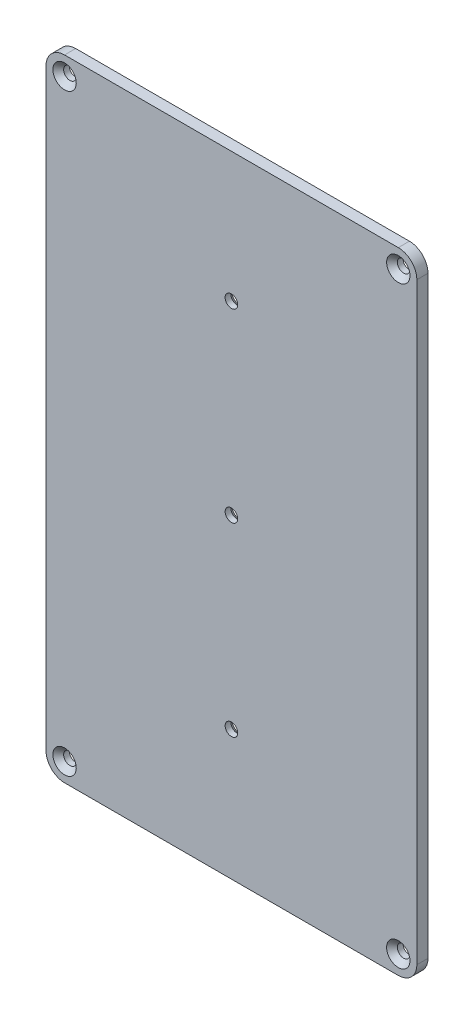
ISO-10303-21;
HEADER;
FILE_DESCRIPTION(('STEP AP214'),'2;1');
FILE_NAME('part.step','',(''),(''),'','','');
FILE_SCHEMA(('AUTOMOTIVE_DESIGN { 1 0 10303 214 1 1 1 1 }'));
ENDSEC;
DATA;
#1=APPLICATION_CONTEXT('core data for automotive mechanical design processes');
#2=APPLICATION_PROTOCOL_DEFINITION('international standard','automotive_design',2000,#1);
#3=PRODUCT_CONTEXT('',#1,'mechanical');
#4=PRODUCT('Part','Part','',(#3));
#5=PRODUCT_RELATED_PRODUCT_CATEGORY('part','',(#4));
#6=PRODUCT_DEFINITION_FORMATION('','',#4);
#7=PRODUCT_DEFINITION_CONTEXT('part definition',#1,'design');
#8=PRODUCT_DEFINITION('design','',#6,#7);
#9=PRODUCT_DEFINITION_SHAPE('','',#8);
#10=(LENGTH_UNIT() NAMED_UNIT(*) SI_UNIT(.MILLI.,.METRE.));
#11=(NAMED_UNIT(*) PLANE_ANGLE_UNIT() SI_UNIT($,.RADIAN.));
#12=(NAMED_UNIT(*) SI_UNIT($,.STERADIAN.) SOLID_ANGLE_UNIT());
#13=UNCERTAINTY_MEASURE_WITH_UNIT(LENGTH_MEASURE(1.E-05),#10,'distance_accuracy_value','');
#14=(GEOMETRIC_REPRESENTATION_CONTEXT(3) GLOBAL_UNCERTAINTY_ASSIGNED_CONTEXT((#13)) GLOBAL_UNIT_ASSIGNED_CONTEXT((#10,
#11,#12)) REPRESENTATION_CONTEXT('',''));
#15=CARTESIAN_POINT('',(0.,0.,0.));
#16=DIRECTION('',(0.,0.,1.));
#17=DIRECTION('',(1.,0.,0.));
#18=AXIS2_PLACEMENT_3D('',#15,#16,#17);
#19=CARTESIAN_POINT('',(0.,0.,3.));
#20=DIRECTION('',(1.,0.,0.));
#21=DIRECTION('',(0.,1.,0.));
#22=AXIS2_PLACEMENT_3D('',#19,#20,#21);
#23=PLANE('',#22);
#24=DIRECTION('',(0.,-1.,0.));
#25=VECTOR('',#24,1.);
#26=CARTESIAN_POINT('',(0.,0.,0.));
#27=LINE('',#26,#25);
#28=CARTESIAN_POINT('',(0.,165.,0.));
#29=VERTEX_POINT('',#28);
#30=CARTESIAN_POINT('',(0.,5.,0.));
#31=VERTEX_POINT('',#30);
#32=EDGE_CURVE('E140',#29,#31,#27,.T.);
#33=ORIENTED_EDGE('',*,*,#32,.T.);
#34=DIRECTION('',(0.,0.,-1.));
#35=VECTOR('',#34,1.);
#36=CARTESIAN_POINT('',(0.,5.,3.));
#37=LINE('',#36,#35);
#38=CARTESIAN_POINT('',(0.,5.,3.));
#39=VERTEX_POINT('',#38);
#40=EDGE_CURVE('E11',#31,#39,#37,.F.);
#41=ORIENTED_EDGE('',*,*,#40,.T.);
#42=DIRECTION('',(0.,-1.,0.));
#43=VECTOR('',#42,1.);
#44=CARTESIAN_POINT('',(0.,0.,3.));
#45=LINE('',#44,#43);
#46=CARTESIAN_POINT('',(0.,165.,3.));
#47=VERTEX_POINT('',#46);
#48=EDGE_CURVE('E128',#47,#39,#45,.T.);
#49=ORIENTED_EDGE('',*,*,#48,.F.);
#50=DIRECTION('',(0.,0.,-1.));
#51=VECTOR('',#50,1.);
#52=CARTESIAN_POINT('',(0.,165.,3.));
#53=LINE('',#52,#51);
#54=EDGE_CURVE('E43',#47,#29,#53,.T.);
#55=ORIENTED_EDGE('',*,*,#54,.T.);
#56=EDGE_LOOP('',(#33,#41,#49,#55));
#57=FACE_BOUND('',#56,.T.);
#58=ADVANCED_FACE('F34',(#57),#23,.F.);
#59=CARTESIAN_POINT('',(0.,0.,3.));
#60=DIRECTION('',(0.,1.,0.));
#61=DIRECTION('',(0.,0.,1.));
#62=AXIS2_PLACEMENT_3D('',#59,#60,#61);
#63=PLANE('',#62);
#64=DIRECTION('',(1.,0.,0.));
#65=VECTOR('',#64,1.);
#66=CARTESIAN_POINT('',(0.,0.,0.));
#67=LINE('',#66,#65);
#68=CARTESIAN_POINT('',(5.,0.,0.));
#69=VERTEX_POINT('',#68);
#70=CARTESIAN_POINT('',(95.,0.,0.));
#71=VERTEX_POINT('',#70);
#72=EDGE_CURVE('E133',#69,#71,#67,.T.);
#73=ORIENTED_EDGE('',*,*,#72,.T.);
#74=DIRECTION('',(0.,0.,-1.));
#75=VECTOR('',#74,1.);
#76=CARTESIAN_POINT('',(95.,0.,3.));
#77=LINE('',#76,#75);
#78=CARTESIAN_POINT('',(95.,0.,3.));
#79=VERTEX_POINT('',#78);
#80=EDGE_CURVE('E51',#71,#79,#77,.F.);
#81=ORIENTED_EDGE('',*,*,#80,.T.);
#82=DIRECTION('',(1.,0.,0.));
#83=VECTOR('',#82,1.);
#84=CARTESIAN_POINT('',(0.,0.,3.));
#85=LINE('',#84,#83);
#86=CARTESIAN_POINT('',(5.,0.,3.));
#87=VERTEX_POINT('',#86);
#88=EDGE_CURVE('E131',#87,#79,#85,.T.);
#89=ORIENTED_EDGE('',*,*,#88,.F.);
#90=DIRECTION('',(0.,0.,-1.));
#91=VECTOR('',#90,1.);
#92=CARTESIAN_POINT('',(5.,0.,3.));
#93=LINE('',#92,#91);
#94=EDGE_CURVE('E172',#87,#69,#93,.T.);
#95=ORIENTED_EDGE('',*,*,#94,.T.);
#96=EDGE_LOOP('',(#73,#81,#89,#95));
#97=FACE_BOUND('',#96,.T.);
#98=ADVANCED_FACE('F224',(#97),#63,.F.);
#99=CARTESIAN_POINT('',(100.,0.,3.));
#100=DIRECTION('',(-1.,0.,0.));
#101=DIRECTION('',(0.,-1.,0.));
#102=AXIS2_PLACEMENT_3D('',#99,#100,#101);
#103=PLANE('',#102);
#104=DIRECTION('',(0.,1.,0.));
#105=VECTOR('',#104,1.);
#106=CARTESIAN_POINT('',(100.,0.,0.));
#107=LINE('',#106,#105);
#108=CARTESIAN_POINT('',(100.,5.,0.));
#109=VERTEX_POINT('',#108);
#110=CARTESIAN_POINT('',(100.,165.,0.));
#111=VERTEX_POINT('',#110);
#112=EDGE_CURVE('E129',#109,#111,#107,.T.);
#113=ORIENTED_EDGE('',*,*,#112,.T.);
#114=DIRECTION('',(0.,0.,-1.));
#115=VECTOR('',#114,1.);
#116=CARTESIAN_POINT('',(100.,165.,3.));
#117=LINE('',#116,#115);
#118=CARTESIAN_POINT('',(100.,165.,3.));
#119=VERTEX_POINT('',#118);
#120=EDGE_CURVE('E107',#111,#119,#117,.F.);
#121=ORIENTED_EDGE('',*,*,#120,.T.);
#122=DIRECTION('',(0.,1.,0.));
#123=VECTOR('',#122,1.);
#124=CARTESIAN_POINT('',(100.,0.,3.));
#125=LINE('',#124,#123);
#126=CARTESIAN_POINT('',(100.,5.,3.));
#127=VERTEX_POINT('',#126);
#128=EDGE_CURVE('E218',#127,#119,#125,.T.);
#129=ORIENTED_EDGE('',*,*,#128,.F.);
#130=DIRECTION('',(0.,0.,-1.));
#131=VECTOR('',#130,1.);
#132=CARTESIAN_POINT('',(100.,5.,3.));
#133=LINE('',#132,#131);
#134=EDGE_CURVE('E112',#127,#109,#133,.T.);
#135=ORIENTED_EDGE('',*,*,#134,.T.);
#136=EDGE_LOOP('',(#113,#121,#129,#135));
#137=FACE_BOUND('',#136,.T.);
#138=ADVANCED_FACE('F233',(#137),#103,.F.);
#139=CARTESIAN_POINT('',(0.,170.,3.));
#140=DIRECTION('',(0.,-1.,0.));
#141=DIRECTION('',(0.,0.,-1.));
#142=AXIS2_PLACEMENT_3D('',#139,#140,#141);
#143=PLANE('',#142);
#144=DIRECTION('',(-1.,0.,0.));
#145=VECTOR('',#144,1.);
#146=CARTESIAN_POINT('',(0.,170.,3.));
#147=LINE('',#146,#145);
#148=CARTESIAN_POINT('',(95.,170.,3.));
#149=VERTEX_POINT('',#148);
#150=CARTESIAN_POINT('',(4.99999999999997,170.,3.));
#151=VERTEX_POINT('',#150);
#152=EDGE_CURVE('E122',#149,#151,#147,.T.);
#153=ORIENTED_EDGE('',*,*,#152,.F.);
#154=DIRECTION('',(0.,0.,-1.));
#155=VECTOR('',#154,1.);
#156=CARTESIAN_POINT('',(95.,170.,3.));
#157=LINE('',#156,#155);
#158=CARTESIAN_POINT('',(95.,170.,0.));
#159=VERTEX_POINT('',#158);
#160=EDGE_CURVE('E106',#149,#159,#157,.T.);
#161=ORIENTED_EDGE('',*,*,#160,.T.);
#162=DIRECTION('',(-1.,0.,0.));
#163=VECTOR('',#162,1.);
#164=CARTESIAN_POINT('',(0.,170.,0.));
#165=LINE('',#164,#163);
#166=CARTESIAN_POINT('',(4.99999999999997,170.,0.));
#167=VERTEX_POINT('',#166);
#168=EDGE_CURVE('E119',#159,#167,#165,.T.);
#169=ORIENTED_EDGE('',*,*,#168,.T.);
#170=DIRECTION('',(0.,0.,-1.));
#171=VECTOR('',#170,1.);
#172=CARTESIAN_POINT('',(4.99999999999997,170.,3.));
#173=LINE('',#172,#171);
#174=EDGE_CURVE('E124',#167,#151,#173,.F.);
#175=ORIENTED_EDGE('',*,*,#174,.T.);
#176=EDGE_LOOP('',(#153,#161,#169,#175));
#177=FACE_BOUND('',#176,.T.);
#178=ADVANCED_FACE('F118',(#177),#143,.F.);
#179=CARTESIAN_POINT('',(0.,0.,3.));
#180=DIRECTION('',(0.,0.,-1.));
#181=DIRECTION('',(-1.,0.,0.));
#182=AXIS2_PLACEMENT_3D('',#179,#180,#181);
#183=PLANE('',#182);
#184=CARTESIAN_POINT('',(50.,135.,3.));
#185=DIRECTION('',(0.,0.,-1.));
#186=DIRECTION('',(-1.,0.,0.));
#187=AXIS2_PLACEMENT_3D('',#184,#185,#186);
#188=CIRCLE('',#187,1.69999999999999);
#189=CARTESIAN_POINT('',(48.3,135.,3.));
#190=VERTEX_POINT('',#189);
#191=EDGE_CURVE('E38',#190,#190,#188,.T.);
#192=ORIENTED_EDGE('',*,*,#191,.T.);
#193=EDGE_LOOP('',(#192));
#194=FACE_BOUND('',#193,.T.);
#195=CARTESIAN_POINT('',(50.,85.,3.));
#196=DIRECTION('',(0.,0.,-1.));
#197=DIRECTION('',(-1.,0.,0.));
#198=AXIS2_PLACEMENT_3D('',#195,#196,#197);
#199=CIRCLE('',#198,1.69999999999999);
#200=CARTESIAN_POINT('',(48.3,85.,3.));
#201=VERTEX_POINT('',#200);
#202=EDGE_CURVE('E182',#201,#201,#199,.T.);
#203=ORIENTED_EDGE('',*,*,#202,.T.);
#204=EDGE_LOOP('',(#203));
#205=FACE_BOUND('',#204,.T.);
#206=CARTESIAN_POINT('',(50.,35.,3.));
#207=DIRECTION('',(0.,0.,-1.));
#208=DIRECTION('',(-1.,0.,0.));
#209=AXIS2_PLACEMENT_3D('',#206,#207,#208);
#210=CIRCLE('',#209,1.69999999999999);
#211=CARTESIAN_POINT('',(48.3,35.,3.));
#212=VERTEX_POINT('',#211);
#213=EDGE_CURVE('E178',#212,#212,#210,.T.);
#214=ORIENTED_EDGE('',*,*,#213,.T.);
#215=EDGE_LOOP('',(#214));
#216=FACE_BOUND('',#215,.T.);
#217=CARTESIAN_POINT('',(4.99999999999997,165.,3.));
#218=DIRECTION('',(0.,0.,1.));
#219=DIRECTION('',(1.,0.,0.));
#220=AXIS2_PLACEMENT_3D('',#217,#218,#219);
#221=CIRCLE('',#220,3.15);
#222=CARTESIAN_POINT('',(8.14999999999997,165.,3.));
#223=VERTEX_POINT('',#222);
#224=EDGE_CURVE('E180',#223,#223,#221,.T.);
#225=ORIENTED_EDGE('',*,*,#224,.F.);
#226=EDGE_LOOP('',(#225));
#227=FACE_BOUND('',#226,.T.);
#228=CARTESIAN_POINT('',(95.,165.,3.));
#229=DIRECTION('',(0.,0.,1.));
#230=DIRECTION('',(1.,0.,0.));
#231=AXIS2_PLACEMENT_3D('',#228,#229,#230);
#232=CIRCLE('',#231,3.15);
#233=CARTESIAN_POINT('',(98.15,165.,3.));
#234=VERTEX_POINT('',#233);
#235=EDGE_CURVE('E155',#234,#234,#232,.T.);
#236=ORIENTED_EDGE('',*,*,#235,.F.);
#237=EDGE_LOOP('',(#236));
#238=FACE_BOUND('',#237,.T.);
#239=CARTESIAN_POINT('',(95.,5.,3.));
#240=DIRECTION('',(0.,0.,1.));
#241=DIRECTION('',(1.,0.,0.));
#242=AXIS2_PLACEMENT_3D('',#239,#240,#241);
#243=CIRCLE('',#242,3.15);
#244=CARTESIAN_POINT('',(98.15,5.,3.));
#245=VERTEX_POINT('',#244);
#246=EDGE_CURVE('E150',#245,#245,#243,.T.);
#247=ORIENTED_EDGE('',*,*,#246,.F.);
#248=EDGE_LOOP('',(#247));
#249=FACE_BOUND('',#248,.T.);
#250=CARTESIAN_POINT('',(4.99999999999999,5.,3.));
#251=DIRECTION('',(0.,0.,1.));
#252=DIRECTION('',(1.,0.,0.));
#253=AXIS2_PLACEMENT_3D('',#250,#251,#252);
#254=CIRCLE('',#253,3.15);
#255=CARTESIAN_POINT('',(8.14999999999999,5.,3.));
#256=VERTEX_POINT('',#255);
#257=EDGE_CURVE('E145',#256,#256,#254,.T.);
#258=ORIENTED_EDGE('',*,*,#257,.F.);
#259=EDGE_LOOP('',(#258));
#260=FACE_BOUND('',#259,.T.);
#261=ORIENTED_EDGE('',*,*,#128,.T.);
#262=CARTESIAN_POINT('',(95.,165.,3.));
#263=DIRECTION('',(0.,0.,-1.));
#264=DIRECTION('',(-1.,0.,0.));
#265=AXIS2_PLACEMENT_3D('',#262,#263,#264);
#266=CIRCLE('',#265,5.);
#267=EDGE_CURVE('E170',#119,#149,#266,.F.);
#268=ORIENTED_EDGE('',*,*,#267,.T.);
#269=ORIENTED_EDGE('',*,*,#152,.T.);
#270=CARTESIAN_POINT('',(4.99999999999997,165.,3.));
#271=DIRECTION('',(0.,0.,-1.));
#272=DIRECTION('',(-1.,0.,0.));
#273=AXIS2_PLACEMENT_3D('',#270,#271,#272);
#274=CIRCLE('',#273,5.);
#275=EDGE_CURVE('E165',#151,#47,#274,.F.);
#276=ORIENTED_EDGE('',*,*,#275,.T.);
#277=ORIENTED_EDGE('',*,*,#48,.T.);
#278=CARTESIAN_POINT('',(5.,5.,3.));
#279=DIRECTION('',(0.,0.,-1.));
#280=DIRECTION('',(-1.,0.,0.));
#281=AXIS2_PLACEMENT_3D('',#278,#279,#280);
#282=CIRCLE('',#281,5.);
#283=EDGE_CURVE('E58',#39,#87,#282,.F.);
#284=ORIENTED_EDGE('',*,*,#283,.T.);
#285=ORIENTED_EDGE('',*,*,#88,.T.);
#286=CARTESIAN_POINT('',(95.,5.,3.));
#287=DIRECTION('',(0.,0.,-1.));
#288=DIRECTION('',(-1.,0.,0.));
#289=AXIS2_PLACEMENT_3D('',#286,#287,#288);
#290=CIRCLE('',#289,5.);
#291=EDGE_CURVE('E168',#79,#127,#290,.F.);
#292=ORIENTED_EDGE('',*,*,#291,.T.);
#293=EDGE_LOOP('',(#261,#268,#269,#276,#277,#284,#285,#292));
#294=FACE_BOUND('',#293,.T.);
#295=ADVANCED_FACE('F231',(#194,#205,#216,#227,#238,#249,#260,#294),#183,.F.);
#296=CARTESIAN_POINT('',(0.,0.,0.));
#297=DIRECTION('',(0.,0.,-1.));
#298=DIRECTION('',(-1.,0.,0.));
#299=AXIS2_PLACEMENT_3D('',#296,#297,#298);
#300=PLANE('',#299);
#301=CARTESIAN_POINT('',(50.,135.,0.));
#302=DIRECTION('',(0.,0.,-1.));
#303=DIRECTION('',(-1.,0.,0.));
#304=AXIS2_PLACEMENT_3D('',#301,#302,#303);
#305=CIRCLE('',#304,3.15);
#306=CARTESIAN_POINT('',(46.85,135.,0.));
#307=VERTEX_POINT('',#306);
#308=EDGE_CURVE('E320',#307,#307,#305,.T.);
#309=ORIENTED_EDGE('',*,*,#308,.F.);
#310=EDGE_LOOP('',(#309));
#311=FACE_BOUND('',#310,.T.);
#312=CARTESIAN_POINT('',(50.,85.,0.));
#313=DIRECTION('',(0.,0.,-1.));
#314=DIRECTION('',(-1.,0.,0.));
#315=AXIS2_PLACEMENT_3D('',#312,#313,#314);
#316=CIRCLE('',#315,3.15);
#317=CARTESIAN_POINT('',(46.85,85.,0.));
#318=VERTEX_POINT('',#317);
#319=EDGE_CURVE('E191',#318,#318,#316,.T.);
#320=ORIENTED_EDGE('',*,*,#319,.F.);
#321=EDGE_LOOP('',(#320));
#322=FACE_BOUND('',#321,.T.);
#323=CARTESIAN_POINT('',(50.,35.,0.));
#324=DIRECTION('',(0.,0.,-1.));
#325=DIRECTION('',(-1.,0.,0.));
#326=AXIS2_PLACEMENT_3D('',#323,#324,#325);
#327=CIRCLE('',#326,3.15);
#328=CARTESIAN_POINT('',(46.85,35.,0.));
#329=VERTEX_POINT('',#328);
#330=EDGE_CURVE('E184',#329,#329,#327,.T.);
#331=ORIENTED_EDGE('',*,*,#330,.F.);
#332=EDGE_LOOP('',(#331));
#333=FACE_BOUND('',#332,.T.);
#334=CARTESIAN_POINT('',(4.99999999999997,165.,0.));
#335=DIRECTION('',(0.,0.,-1.));
#336=DIRECTION('',(-1.,0.,0.));
#337=AXIS2_PLACEMENT_3D('',#334,#335,#336);
#338=CIRCLE('',#337,1.69999999999999);
#339=CARTESIAN_POINT('',(3.29999999999998,165.,0.));
#340=VERTEX_POINT('',#339);
#341=EDGE_CURVE('E152',#340,#340,#338,.T.);
#342=ORIENTED_EDGE('',*,*,#341,.F.);
#343=EDGE_LOOP('',(#342));
#344=FACE_BOUND('',#343,.T.);
#345=CARTESIAN_POINT('',(95.,165.,0.));
#346=DIRECTION('',(0.,0.,-1.));
#347=DIRECTION('',(-1.,0.,0.));
#348=AXIS2_PLACEMENT_3D('',#345,#346,#347);
#349=CIRCLE('',#348,1.69999999999999);
#350=CARTESIAN_POINT('',(93.3,165.,0.));
#351=VERTEX_POINT('',#350);
#352=EDGE_CURVE('E147',#351,#351,#349,.T.);
#353=ORIENTED_EDGE('',*,*,#352,.F.);
#354=EDGE_LOOP('',(#353));
#355=FACE_BOUND('',#354,.T.);
#356=CARTESIAN_POINT('',(95.,5.,0.));
#357=DIRECTION('',(0.,0.,-1.));
#358=DIRECTION('',(-1.,0.,0.));
#359=AXIS2_PLACEMENT_3D('',#356,#357,#358);
#360=CIRCLE('',#359,1.69999999999999);
#361=CARTESIAN_POINT('',(93.3,5.,0.));
#362=VERTEX_POINT('',#361);
#363=EDGE_CURVE('E142',#362,#362,#360,.T.);
#364=ORIENTED_EDGE('',*,*,#363,.F.);
#365=EDGE_LOOP('',(#364));
#366=FACE_BOUND('',#365,.T.);
#367=CARTESIAN_POINT('',(4.99999999999999,5.,0.));
#368=DIRECTION('',(0.,0.,-1.));
#369=DIRECTION('',(-1.,0.,0.));
#370=AXIS2_PLACEMENT_3D('',#367,#368,#369);
#371=CIRCLE('',#370,1.69999999999999);
#372=CARTESIAN_POINT('',(3.3,5.,0.));
#373=VERTEX_POINT('',#372);
#374=EDGE_CURVE('E137',#373,#373,#371,.T.);
#375=ORIENTED_EDGE('',*,*,#374,.F.);
#376=EDGE_LOOP('',(#375));
#377=FACE_BOUND('',#376,.T.);
#378=ORIENTED_EDGE('',*,*,#168,.F.);
#379=CARTESIAN_POINT('',(95.,165.,0.));
#380=DIRECTION('',(0.,0.,-1.));
#381=DIRECTION('',(-1.,0.,0.));
#382=AXIS2_PLACEMENT_3D('',#379,#380,#381);
#383=CIRCLE('',#382,5.);
#384=EDGE_CURVE('E102',#159,#111,#383,.T.);
#385=ORIENTED_EDGE('',*,*,#384,.T.);
#386=ORIENTED_EDGE('',*,*,#112,.F.);
#387=CARTESIAN_POINT('',(95.,5.,0.));
#388=DIRECTION('',(0.,0.,-1.));
#389=DIRECTION('',(-1.,0.,0.));
#390=AXIS2_PLACEMENT_3D('',#387,#388,#389);
#391=CIRCLE('',#390,5.);
#392=EDGE_CURVE('E113',#109,#71,#391,.T.);
#393=ORIENTED_EDGE('',*,*,#392,.T.);
#394=ORIENTED_EDGE('',*,*,#72,.F.);
#395=CARTESIAN_POINT('',(5.,5.,0.));
#396=DIRECTION('',(0.,0.,-1.));
#397=DIRECTION('',(-1.,0.,0.));
#398=AXIS2_PLACEMENT_3D('',#395,#396,#397);
#399=CIRCLE('',#398,5.);
#400=EDGE_CURVE('E159',#69,#31,#399,.T.);
#401=ORIENTED_EDGE('',*,*,#400,.T.);
#402=ORIENTED_EDGE('',*,*,#32,.F.);
#403=CARTESIAN_POINT('',(4.99999999999997,165.,0.));
#404=DIRECTION('',(0.,0.,-1.));
#405=DIRECTION('',(-1.,0.,0.));
#406=AXIS2_PLACEMENT_3D('',#403,#404,#405);
#407=CIRCLE('',#406,5.);
#408=EDGE_CURVE('E123',#29,#167,#407,.T.);
#409=ORIENTED_EDGE('',*,*,#408,.T.);
#410=EDGE_LOOP('',(#378,#385,#386,#393,#394,#401,#402,#409));
#411=FACE_BOUND('',#410,.T.);
#412=ADVANCED_FACE('F126',(#311,#322,#333,#344,#355,#366,#377,#411),#300,.T.);
#413=CARTESIAN_POINT('',(4.99999999999999,5.,3.));
#414=DIRECTION('',(0.,0.,1.));
#415=DIRECTION('',(1.,0.,0.));
#416=AXIS2_PLACEMENT_3D('',#413,#414,#415);
#417=CYLINDRICAL_SURFACE('',#416,1.69999999999999);
#418=ORIENTED_EDGE('',*,*,#374,.T.);
#419=EDGE_LOOP('',(#418));
#420=FACE_BOUND('',#419,.T.);
#421=CARTESIAN_POINT('',(4.99999999999999,5.,1.55));
#422=DIRECTION('',(0.,0.,1.));
#423=DIRECTION('',(1.,0.,0.));
#424=AXIS2_PLACEMENT_3D('',#421,#422,#423);
#425=CIRCLE('',#424,1.7);
#426=CARTESIAN_POINT('',(6.69999999999999,5.,1.55));
#427=VERTEX_POINT('',#426);
#428=EDGE_CURVE('E141',#427,#427,#425,.T.);
#429=ORIENTED_EDGE('',*,*,#428,.T.);
#430=EDGE_LOOP('',(#429));
#431=FACE_BOUND('',#430,.T.);
#432=ADVANCED_FACE('F305',(#420,#431),#417,.F.);
#433=CARTESIAN_POINT('',(4.99999999999999,5.,3.));
#434=DIRECTION('',(0.,0.,1.));
#435=DIRECTION('',(1.,0.,0.));
#436=AXIS2_PLACEMENT_3D('',#433,#434,#435);
#437=CONICAL_SURFACE('',#436,3.15,0.785398163397448);
#438=ORIENTED_EDGE('',*,*,#428,.F.);
#439=EDGE_LOOP('',(#438));
#440=FACE_BOUND('',#439,.T.);
#441=ORIENTED_EDGE('',*,*,#257,.T.);
#442=EDGE_LOOP('',(#441));
#443=FACE_BOUND('',#442,.T.);
#444=ADVANCED_FACE('F301',(#440,#443),#437,.F.);
#445=CARTESIAN_POINT('',(95.,5.,3.));
#446=DIRECTION('',(0.,0.,1.));
#447=DIRECTION('',(1.,0.,0.));
#448=AXIS2_PLACEMENT_3D('',#445,#446,#447);
#449=CYLINDRICAL_SURFACE('',#448,1.69999999999999);
#450=ORIENTED_EDGE('',*,*,#363,.T.);
#451=EDGE_LOOP('',(#450));
#452=FACE_BOUND('',#451,.T.);
#453=CARTESIAN_POINT('',(95.,5.,1.55));
#454=DIRECTION('',(0.,0.,1.));
#455=DIRECTION('',(1.,0.,0.));
#456=AXIS2_PLACEMENT_3D('',#453,#454,#455);
#457=CIRCLE('',#456,1.69999999999999);
#458=CARTESIAN_POINT('',(96.7,5.,1.55));
#459=VERTEX_POINT('',#458);
#460=EDGE_CURVE('E146',#459,#459,#457,.T.);
#461=ORIENTED_EDGE('',*,*,#460,.T.);
#462=EDGE_LOOP('',(#461));
#463=FACE_BOUND('',#462,.T.);
#464=ADVANCED_FACE('F297',(#452,#463),#449,.F.);
#465=CARTESIAN_POINT('',(95.,5.,3.));
#466=DIRECTION('',(0.,0.,1.));
#467=DIRECTION('',(1.,0.,0.));
#468=AXIS2_PLACEMENT_3D('',#465,#466,#467);
#469=CONICAL_SURFACE('',#468,3.15,0.78539816339745);
#470=ORIENTED_EDGE('',*,*,#460,.F.);
#471=EDGE_LOOP('',(#470));
#472=FACE_BOUND('',#471,.T.);
#473=ORIENTED_EDGE('',*,*,#246,.T.);
#474=EDGE_LOOP('',(#473));
#475=FACE_BOUND('',#474,.T.);
#476=ADVANCED_FACE('F293',(#472,#475),#469,.F.);
#477=CARTESIAN_POINT('',(95.,165.,3.));
#478=DIRECTION('',(0.,0.,1.));
#479=DIRECTION('',(1.,0.,0.));
#480=AXIS2_PLACEMENT_3D('',#477,#478,#479);
#481=CYLINDRICAL_SURFACE('',#480,1.69999999999999);
#482=ORIENTED_EDGE('',*,*,#352,.T.);
#483=EDGE_LOOP('',(#482));
#484=FACE_BOUND('',#483,.T.);
#485=CARTESIAN_POINT('',(95.,165.,1.55));
#486=DIRECTION('',(0.,0.,1.));
#487=DIRECTION('',(1.,0.,0.));
#488=AXIS2_PLACEMENT_3D('',#485,#486,#487);
#489=CIRCLE('',#488,1.69999999999999);
#490=CARTESIAN_POINT('',(96.7,165.,1.55));
#491=VERTEX_POINT('',#490);
#492=EDGE_CURVE('E151',#491,#491,#489,.T.);
#493=ORIENTED_EDGE('',*,*,#492,.T.);
#494=EDGE_LOOP('',(#493));
#495=FACE_BOUND('',#494,.T.);
#496=ADVANCED_FACE('F289',(#484,#495),#481,.F.);
#497=CARTESIAN_POINT('',(95.,165.,3.));
#498=DIRECTION('',(0.,0.,1.));
#499=DIRECTION('',(1.,0.,0.));
#500=AXIS2_PLACEMENT_3D('',#497,#498,#499);
#501=CONICAL_SURFACE('',#500,3.15,0.78539816339745);
#502=ORIENTED_EDGE('',*,*,#492,.F.);
#503=EDGE_LOOP('',(#502));
#504=FACE_BOUND('',#503,.T.);
#505=ORIENTED_EDGE('',*,*,#235,.T.);
#506=EDGE_LOOP('',(#505));
#507=FACE_BOUND('',#506,.T.);
#508=ADVANCED_FACE('F285',(#504,#507),#501,.F.);
#509=CARTESIAN_POINT('',(4.99999999999997,165.,3.));
#510=DIRECTION('',(0.,0.,1.));
#511=DIRECTION('',(1.,0.,0.));
#512=AXIS2_PLACEMENT_3D('',#509,#510,#511);
#513=CYLINDRICAL_SURFACE('',#512,1.69999999999999);
#514=ORIENTED_EDGE('',*,*,#341,.T.);
#515=EDGE_LOOP('',(#514));
#516=FACE_BOUND('',#515,.T.);
#517=CARTESIAN_POINT('',(4.99999999999997,165.,1.55));
#518=DIRECTION('',(0.,0.,1.));
#519=DIRECTION('',(1.,0.,0.));
#520=AXIS2_PLACEMENT_3D('',#517,#518,#519);
#521=CIRCLE('',#520,1.7);
#522=CARTESIAN_POINT('',(6.69999999999997,165.,1.55));
#523=VERTEX_POINT('',#522);
#524=EDGE_CURVE('E156',#523,#523,#521,.T.);
#525=ORIENTED_EDGE('',*,*,#524,.T.);
#526=EDGE_LOOP('',(#525));
#527=FACE_BOUND('',#526,.T.);
#528=ADVANCED_FACE('F281',(#516,#527),#513,.F.);
#529=CARTESIAN_POINT('',(4.99999999999997,165.,3.));
#530=DIRECTION('',(0.,0.,1.));
#531=DIRECTION('',(1.,0.,0.));
#532=AXIS2_PLACEMENT_3D('',#529,#530,#531);
#533=CONICAL_SURFACE('',#532,3.15,0.785398163397448);
#534=ORIENTED_EDGE('',*,*,#524,.F.);
#535=EDGE_LOOP('',(#534));
#536=FACE_BOUND('',#535,.T.);
#537=ORIENTED_EDGE('',*,*,#224,.T.);
#538=EDGE_LOOP('',(#537));
#539=FACE_BOUND('',#538,.T.);
#540=ADVANCED_FACE('F250',(#536,#539),#533,.F.);
#541=CARTESIAN_POINT('',(95.,165.,3.));
#542=DIRECTION('',(0.,0.,-1.));
#543=DIRECTION('',(-1.,0.,0.));
#544=AXIS2_PLACEMENT_3D('',#541,#542,#543);
#545=CYLINDRICAL_SURFACE('',#544,5.);
#546=ORIENTED_EDGE('',*,*,#267,.F.);
#547=ORIENTED_EDGE('',*,*,#120,.F.);
#548=ORIENTED_EDGE('',*,*,#384,.F.);
#549=ORIENTED_EDGE('',*,*,#160,.F.);
#550=EDGE_LOOP('',(#546,#547,#548,#549));
#551=FACE_BOUND('',#550,.T.);
#552=ADVANCED_FACE('F105',(#551),#545,.T.);
#553=CARTESIAN_POINT('',(95.,5.,3.));
#554=DIRECTION('',(0.,0.,-1.));
#555=DIRECTION('',(-1.,0.,0.));
#556=AXIS2_PLACEMENT_3D('',#553,#554,#555);
#557=CYLINDRICAL_SURFACE('',#556,5.);
#558=ORIENTED_EDGE('',*,*,#291,.F.);
#559=ORIENTED_EDGE('',*,*,#80,.F.);
#560=ORIENTED_EDGE('',*,*,#392,.F.);
#561=ORIENTED_EDGE('',*,*,#134,.F.);
#562=EDGE_LOOP('',(#558,#559,#560,#561));
#563=FACE_BOUND('',#562,.T.);
#564=ADVANCED_FACE('F228',(#563),#557,.T.);
#565=CARTESIAN_POINT('',(5.,5.,3.));
#566=DIRECTION('',(0.,0.,-1.));
#567=DIRECTION('',(-1.,0.,0.));
#568=AXIS2_PLACEMENT_3D('',#565,#566,#567);
#569=CYLINDRICAL_SURFACE('',#568,5.);
#570=ORIENTED_EDGE('',*,*,#283,.F.);
#571=ORIENTED_EDGE('',*,*,#40,.F.);
#572=ORIENTED_EDGE('',*,*,#400,.F.);
#573=ORIENTED_EDGE('',*,*,#94,.F.);
#574=EDGE_LOOP('',(#570,#571,#572,#573));
#575=FACE_BOUND('',#574,.T.);
#576=ADVANCED_FACE('F252',(#575),#569,.T.);
#577=CARTESIAN_POINT('',(4.99999999999997,165.,3.));
#578=DIRECTION('',(0.,0.,-1.));
#579=DIRECTION('',(-1.,0.,0.));
#580=AXIS2_PLACEMENT_3D('',#577,#578,#579);
#581=CYLINDRICAL_SURFACE('',#580,5.);
#582=ORIENTED_EDGE('',*,*,#275,.F.);
#583=ORIENTED_EDGE('',*,*,#174,.F.);
#584=ORIENTED_EDGE('',*,*,#408,.F.);
#585=ORIENTED_EDGE('',*,*,#54,.F.);
#586=EDGE_LOOP('',(#582,#583,#584,#585));
#587=FACE_BOUND('',#586,.T.);
#588=ADVANCED_FACE('F36',(#587),#581,.T.);
#589=CARTESIAN_POINT('',(50.,35.,0.));
#590=DIRECTION('',(0.,0.,-1.));
#591=DIRECTION('',(-1.,0.,0.));
#592=AXIS2_PLACEMENT_3D('',#589,#590,#591);
#593=CYLINDRICAL_SURFACE('',#592,1.69999999999999);
#594=CARTESIAN_POINT('',(50.,35.,1.45000000000001));
#595=DIRECTION('',(0.,0.,-1.));
#596=DIRECTION('',(-1.,0.,0.));
#597=AXIS2_PLACEMENT_3D('',#594,#595,#596);
#598=CIRCLE('',#597,1.69999999999999);
#599=CARTESIAN_POINT('',(48.3,35.,1.45000000000001));
#600=VERTEX_POINT('',#599);
#601=EDGE_CURVE('E181',#600,#600,#598,.T.);
#602=ORIENTED_EDGE('',*,*,#601,.T.);
#603=EDGE_LOOP('',(#602));
#604=FACE_BOUND('',#603,.T.);
#605=ORIENTED_EDGE('',*,*,#213,.F.);
#606=EDGE_LOOP('',(#605));
#607=FACE_BOUND('',#606,.T.);
#608=ADVANCED_FACE('F258',(#604,#607),#593,.F.);
#609=CARTESIAN_POINT('',(50.,35.,0.));
#610=DIRECTION('',(0.,0.,-1.));
#611=DIRECTION('',(-1.,0.,0.));
#612=AXIS2_PLACEMENT_3D('',#609,#610,#611);
#613=CONICAL_SURFACE('',#612,3.15,0.78539816339745);
#614=ORIENTED_EDGE('',*,*,#601,.F.);
#615=EDGE_LOOP('',(#614));
#616=FACE_BOUND('',#615,.T.);
#617=ORIENTED_EDGE('',*,*,#330,.T.);
#618=EDGE_LOOP('',(#617));
#619=FACE_BOUND('',#618,.T.);
#620=ADVANCED_FACE('F267',(#616,#619),#613,.F.);
#621=CARTESIAN_POINT('',(50.,85.,0.));
#622=DIRECTION('',(0.,0.,-1.));
#623=DIRECTION('',(-1.,0.,0.));
#624=AXIS2_PLACEMENT_3D('',#621,#622,#623);
#625=CYLINDRICAL_SURFACE('',#624,1.69999999999999);
#626=CARTESIAN_POINT('',(50.,85.,1.45000000000001));
#627=DIRECTION('',(0.,0.,-1.));
#628=DIRECTION('',(-1.,0.,0.));
#629=AXIS2_PLACEMENT_3D('',#626,#627,#628);
#630=CIRCLE('',#629,1.69999999999999);
#631=CARTESIAN_POINT('',(48.3,85.,1.45000000000001));
#632=VERTEX_POINT('',#631);
#633=EDGE_CURVE('E185',#632,#632,#630,.T.);
#634=ORIENTED_EDGE('',*,*,#633,.T.);
#635=EDGE_LOOP('',(#634));
#636=FACE_BOUND('',#635,.T.);
#637=ORIENTED_EDGE('',*,*,#202,.F.);
#638=EDGE_LOOP('',(#637));
#639=FACE_BOUND('',#638,.T.);
#640=ADVANCED_FACE('F273',(#636,#639),#625,.F.);
#641=CARTESIAN_POINT('',(50.,85.,0.));
#642=DIRECTION('',(0.,0.,-1.));
#643=DIRECTION('',(-1.,0.,0.));
#644=AXIS2_PLACEMENT_3D('',#641,#642,#643);
#645=CONICAL_SURFACE('',#644,3.15,0.78539816339745);
#646=ORIENTED_EDGE('',*,*,#633,.F.);
#647=EDGE_LOOP('',(#646));
#648=FACE_BOUND('',#647,.T.);
#649=ORIENTED_EDGE('',*,*,#319,.T.);
#650=EDGE_LOOP('',(#649));
#651=FACE_BOUND('',#650,.T.);
#652=ADVANCED_FACE('F354',(#648,#651),#645,.F.);
#653=CARTESIAN_POINT('',(50.,135.,0.));
#654=DIRECTION('',(0.,0.,-1.));
#655=DIRECTION('',(-1.,0.,0.));
#656=AXIS2_PLACEMENT_3D('',#653,#654,#655);
#657=CYLINDRICAL_SURFACE('',#656,1.69999999999999);
#658=CARTESIAN_POINT('',(50.,135.,1.45000000000001));
#659=DIRECTION('',(0.,0.,-1.));
#660=DIRECTION('',(-1.,0.,0.));
#661=AXIS2_PLACEMENT_3D('',#658,#659,#660);
#662=CIRCLE('',#661,1.69999999999999);
#663=CARTESIAN_POINT('',(48.3,135.,1.45000000000001));
#664=VERTEX_POINT('',#663);
#665=EDGE_CURVE('E374',#664,#664,#662,.T.);
#666=ORIENTED_EDGE('',*,*,#665,.T.);
#667=EDGE_LOOP('',(#666));
#668=FACE_BOUND('',#667,.T.);
#669=ORIENTED_EDGE('',*,*,#191,.F.);
#670=EDGE_LOOP('',(#669));
#671=FACE_BOUND('',#670,.T.);
#672=ADVANCED_FACE('F356',(#668,#671),#657,.F.);
#673=CARTESIAN_POINT('',(50.,135.,0.));
#674=DIRECTION('',(0.,0.,-1.));
#675=DIRECTION('',(-1.,0.,0.));
#676=AXIS2_PLACEMENT_3D('',#673,#674,#675);
#677=CONICAL_SURFACE('',#676,3.15,0.78539816339745);
#678=ORIENTED_EDGE('',*,*,#665,.F.);
#679=EDGE_LOOP('',(#678));
#680=FACE_BOUND('',#679,.T.);
#681=ORIENTED_EDGE('',*,*,#308,.T.);
#682=EDGE_LOOP('',(#681));
#683=FACE_BOUND('',#682,.T.);
#684=ADVANCED_FACE('F363',(#680,#683),#677,.F.);
#685=CLOSED_SHELL('',(#58,#98,#138,#178,#295,#412,#432,#444,#464,#476,#496,#508,#528,#540,#552,
#564,#576,#588,#608,#620,#640,#652,#672,#684));
#686=MANIFOLD_SOLID_BREP('B2',#685);
#687=ADVANCED_BREP_SHAPE_REPRESENTATION('',(#18,#686),#14);
#688=SHAPE_DEFINITION_REPRESENTATION(#9,#687);
ENDSEC;
END-ISO-10303-21;
